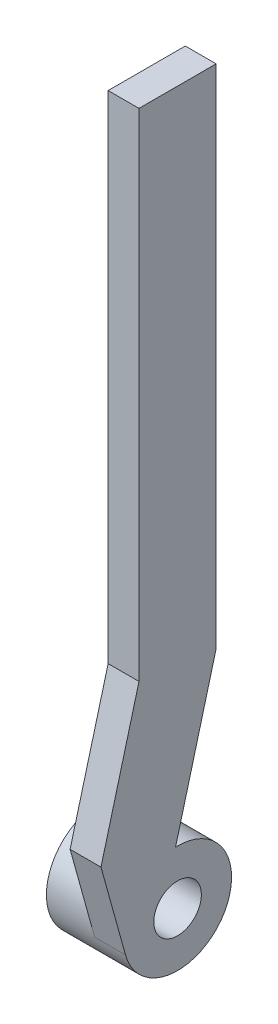
ISO-10303-21;
HEADER;
FILE_DESCRIPTION(('STEP AP214'),'2;1');
FILE_NAME('part.step','',(''),(''),'','','');
FILE_SCHEMA(('AUTOMOTIVE_DESIGN { 1 0 10303 214 1 1 1 1 }'));
ENDSEC;
DATA;
#1=APPLICATION_CONTEXT('core data for automotive mechanical design processes');
#2=APPLICATION_PROTOCOL_DEFINITION('international standard','automotive_design',2000,#1);
#3=PRODUCT_CONTEXT('',#1,'mechanical');
#4=PRODUCT('Part','Part','',(#3));
#5=PRODUCT_RELATED_PRODUCT_CATEGORY('part','',(#4));
#6=PRODUCT_DEFINITION_FORMATION('','',#4);
#7=PRODUCT_DEFINITION_CONTEXT('part definition',#1,'design');
#8=PRODUCT_DEFINITION('design','',#6,#7);
#9=PRODUCT_DEFINITION_SHAPE('','',#8);
#10=(LENGTH_UNIT() NAMED_UNIT(*) SI_UNIT(.MILLI.,.METRE.));
#11=(NAMED_UNIT(*) PLANE_ANGLE_UNIT() SI_UNIT($,.RADIAN.));
#12=(NAMED_UNIT(*) SI_UNIT($,.STERADIAN.) SOLID_ANGLE_UNIT());
#13=UNCERTAINTY_MEASURE_WITH_UNIT(LENGTH_MEASURE(1.E-05),#10,'distance_accuracy_value','');
#14=(GEOMETRIC_REPRESENTATION_CONTEXT(3) GLOBAL_UNCERTAINTY_ASSIGNED_CONTEXT((#13)) GLOBAL_UNIT_ASSIGNED_CONTEXT((#10,
#11,#12)) REPRESENTATION_CONTEXT('',''));
#15=CARTESIAN_POINT('',(0.,0.,0.));
#16=DIRECTION('',(0.,0.,1.));
#17=DIRECTION('',(1.,0.,0.));
#18=AXIS2_PLACEMENT_3D('',#15,#16,#17);
#19=CARTESIAN_POINT('',(-30.145,0.,0.));
#20=DIRECTION('',(1.,0.,0.));
#21=DIRECTION('',(0.,0.,1.));
#22=AXIS2_PLACEMENT_3D('',#19,#20,#21);
#23=CYLINDRICAL_SURFACE('',#22,7.);
#24=CARTESIAN_POINT('',(-30.145,0.,0.));
#25=DIRECTION('',(1.,0.,0.));
#26=DIRECTION('',(0.,0.,-1.));
#27=AXIS2_PLACEMENT_3D('',#24,#25,#26);
#28=CIRCLE('',#27,7.);
#29=CARTESIAN_POINT('',(-30.145,0.,-7.));
#30=VERTEX_POINT('',#29);
#31=EDGE_CURVE('E11',#30,#30,#28,.T.);
#32=ORIENTED_EDGE('',*,*,#31,.T.);
#33=EDGE_LOOP('',(#32));
#34=FACE_BOUND('',#33,.T.);
#35=DIRECTION('',(1.,0.,0.));
#36=VECTOR('',#35,1.);
#37=CARTESIAN_POINT('',(-24.145,6.99491771434268,0.266694899791794));
#38=LINE('',#37,#36);
#39=CARTESIAN_POINT('',(-24.145,6.99491771434268,0.266694899791794));
#40=VERTEX_POINT('',#39);
#41=CARTESIAN_POINT('',(-20.145,6.99491771434268,0.266694899791793));
#42=VERTEX_POINT('',#41);
#43=EDGE_CURVE('E111',#40,#42,#38,.T.);
#44=ORIENTED_EDGE('',*,*,#43,.T.);
#45=CARTESIAN_POINT('',(-20.145,0.,0.));
#46=DIRECTION('',(1.,0.,0.));
#47=DIRECTION('',(0.,0.,-1.));
#48=AXIS2_PLACEMENT_3D('',#45,#46,#47);
#49=CIRCLE('',#48,7.);
#50=CARTESIAN_POINT('',(-20.145,-1.87292477240286,6.74478708314204));
#51=VERTEX_POINT('',#50);
#52=EDGE_CURVE('E41',#51,#42,#49,.T.);
#53=ORIENTED_EDGE('',*,*,#52,.F.);
#54=DIRECTION('',(1.,0.,0.));
#55=VECTOR('',#54,1.);
#56=CARTESIAN_POINT('',(-24.145,-1.87292477240286,6.74478708314204));
#57=LINE('',#56,#55);
#58=CARTESIAN_POINT('',(-24.145,-1.87292477240286,6.74478708314204));
#59=VERTEX_POINT('',#58);
#60=EDGE_CURVE('E130',#59,#51,#57,.T.);
#61=ORIENTED_EDGE('',*,*,#60,.F.);
#62=CARTESIAN_POINT('',(-24.145,0.,0.));
#63=DIRECTION('',(1.,0.,0.));
#64=DIRECTION('',(0.,0.,-1.));
#65=AXIS2_PLACEMENT_3D('',#62,#63,#64);
#66=CIRCLE('',#65,7.);
#67=EDGE_CURVE('E117',#40,#59,#66,.T.);
#68=ORIENTED_EDGE('',*,*,#67,.F.);
#69=EDGE_LOOP('',(#44,#53,#61,#68));
#70=FACE_BOUND('',#69,.T.);
#71=ADVANCED_FACE('F37',(#34,#70),#23,.T.);
#72=CARTESIAN_POINT('',(-30.145,0.,0.));
#73=DIRECTION('',(1.,0.,0.));
#74=DIRECTION('',(0.,0.,1.));
#75=AXIS2_PLACEMENT_3D('',#72,#73,#74);
#76=CYLINDRICAL_SURFACE('',#75,3.0845);
#77=CARTESIAN_POINT('',(-20.145,0.,0.));
#78=DIRECTION('',(1.,0.,0.));
#79=DIRECTION('',(0.,0.,-1.));
#80=AXIS2_PLACEMENT_3D('',#77,#78,#79);
#81=CIRCLE('',#80,3.0845);
#82=CARTESIAN_POINT('',(-20.145,0.,-3.0845));
#83=VERTEX_POINT('',#82);
#84=EDGE_CURVE('E155',#83,#83,#81,.T.);
#85=ORIENTED_EDGE('',*,*,#84,.T.);
#86=EDGE_LOOP('',(#85));
#87=FACE_BOUND('',#86,.T.);
#88=CARTESIAN_POINT('',(-27.145,0.,0.));
#89=DIRECTION('',(1.,0.,0.));
#90=DIRECTION('',(0.,0.,-1.));
#91=AXIS2_PLACEMENT_3D('',#88,#89,#90);
#92=CIRCLE('',#91,3.0845);
#93=CARTESIAN_POINT('',(-27.145,0.,-3.0845));
#94=VERTEX_POINT('',#93);
#95=EDGE_CURVE('E153',#94,#94,#92,.T.);
#96=ORIENTED_EDGE('',*,*,#95,.F.);
#97=EDGE_LOOP('',(#96));
#98=FACE_BOUND('',#97,.T.);
#99=ADVANCED_FACE('F39',(#87,#98),#76,.F.);
#100=CARTESIAN_POINT('',(-30.145,0.,0.));
#101=DIRECTION('',(-1.,0.,0.));
#102=DIRECTION('',(0.,0.,-1.));
#103=AXIS2_PLACEMENT_3D('',#100,#101,#102);
#104=PLANE('',#103);
#105=ORIENTED_EDGE('',*,*,#31,.F.);
#106=EDGE_LOOP('',(#105));
#107=FACE_BOUND('',#106,.T.);
#108=ADVANCED_FACE('F191',(#107),#104,.T.);
#109=CARTESIAN_POINT('',(-20.145,0.,0.));
#110=DIRECTION('',(-1.,0.,0.));
#111=DIRECTION('',(0.,0.,-1.));
#112=AXIS2_PLACEMENT_3D('',#109,#110,#111);
#113=PLANE('',#112);
#114=ORIENTED_EDGE('',*,*,#84,.F.);
#115=EDGE_LOOP('',(#114));
#116=FACE_BOUND('',#115,.T.);
#117=ORIENTED_EDGE('',*,*,#52,.T.);
#118=DIRECTION('',(0.,0.965925826289068,-0.258819045102522));
#119=VECTOR('',#118,1.);
#120=CARTESIAN_POINT('',(-20.145,0.535244363118021,1.99755915762129));
#121=LINE('',#120,#119);
#122=CARTESIAN_POINT('',(-20.145,26.6504906683294,-4.99999999999999));
#123=VERTEX_POINT('',#122);
#124=EDGE_CURVE('E131',#42,#123,#121,.T.);
#125=ORIENTED_EDGE('',*,*,#124,.T.);
#126=DIRECTION('',(0.,1.,0.));
#127=VECTOR('',#126,1.);
#128=CARTESIAN_POINT('',(-20.145,0.,-4.99999999999999));
#129=LINE('',#128,#127);
#130=CARTESIAN_POINT('',(-20.145,92.2878720852358,-5.));
#131=VERTEX_POINT('',#130);
#132=EDGE_CURVE('E108',#123,#131,#129,.T.);
#133=ORIENTED_EDGE('',*,*,#132,.T.);
#134=DIRECTION('',(0.,0.,1.));
#135=VECTOR('',#134,1.);
#136=CARTESIAN_POINT('',(-20.145,92.2878720852358,0.));
#137=LINE('',#136,#135);
#138=CARTESIAN_POINT('',(-20.145,92.2878720852358,5.));
#139=VERTEX_POINT('',#138);
#140=EDGE_CURVE('E134',#131,#139,#137,.T.);
#141=ORIENTED_EDGE('',*,*,#140,.T.);
#142=DIRECTION('',(0.,-1.,0.));
#143=VECTOR('',#142,1.);
#144=CARTESIAN_POINT('',(-20.145,0.,5.));
#145=LINE('',#144,#143);
#146=CARTESIAN_POINT('',(-20.145,27.9670156442034,5.));
#147=VERTEX_POINT('',#146);
#148=EDGE_CURVE('E137',#139,#147,#145,.T.);
#149=ORIENTED_EDGE('',*,*,#148,.T.);
#150=DIRECTION('',(0.,-0.965925826289068,0.258819045102522));
#151=VECTOR('',#150,1.);
#152=CARTESIAN_POINT('',(-20.145,3.12343481414324,11.656817420512));
#153=LINE('',#152,#151);
#154=CARTESIAN_POINT('',(-20.145,9.5831081653679,9.92595316268248));
#155=VERTEX_POINT('',#154);
#156=EDGE_CURVE('E140',#147,#155,#153,.T.);
#157=ORIENTED_EDGE('',*,*,#156,.T.);
#158=DIRECTION('',(0.,-0.963541011877434,-0.267560681771837));
#159=VECTOR('',#158,1.);
#160=CARTESIAN_POINT('',(-20.145,-1.87292477240286,6.74478708314204));
#161=LINE('',#160,#159);
#162=EDGE_CURVE('E119',#155,#51,#161,.T.);
#163=ORIENTED_EDGE('',*,*,#162,.T.);
#164=EDGE_LOOP('',(#117,#125,#133,#141,#149,#157,#163));
#165=FACE_BOUND('',#164,.T.);
#166=ADVANCED_FACE('F162',(#116,#165),#113,.F.);
#167=CARTESIAN_POINT('',(-27.145,0.,0.));
#168=DIRECTION('',(-1.,0.,0.));
#169=DIRECTION('',(0.,0.,-1.));
#170=AXIS2_PLACEMENT_3D('',#167,#168,#169);
#171=PLANE('',#170);
#172=ORIENTED_EDGE('',*,*,#95,.T.);
#173=EDGE_LOOP('',(#172));
#174=FACE_BOUND('',#173,.T.);
#175=ADVANCED_FACE('F195',(#174),#171,.F.);
#176=CARTESIAN_POINT('',(-24.145,0.535244363118021,1.99755915762129));
#177=DIRECTION('',(0.,0.258819045102522,0.965925826289068));
#178=DIRECTION('',(0.,0.965925826289068,-0.258819045102522));
#179=AXIS2_PLACEMENT_3D('',#176,#177,#178);
#180=PLANE('',#179);
#181=ORIENTED_EDGE('',*,*,#124,.F.);
#182=ORIENTED_EDGE('',*,*,#43,.F.);
#183=DIRECTION('',(0.,0.965925826289068,-0.258819045102522));
#184=VECTOR('',#183,1.);
#185=CARTESIAN_POINT('',(-24.145,0.535244363118021,1.99755915762129));
#186=LINE('',#185,#184);
#187=CARTESIAN_POINT('',(-24.145,26.6504906683294,-4.99999999999999));
#188=VERTEX_POINT('',#187);
#189=EDGE_CURVE('E60',#40,#188,#186,.T.);
#190=ORIENTED_EDGE('',*,*,#189,.T.);
#191=DIRECTION('',(1.,0.,0.));
#192=VECTOR('',#191,1.);
#193=CARTESIAN_POINT('',(-24.145,26.6504906683294,-4.99999999999999));
#194=LINE('',#193,#192);
#195=EDGE_CURVE('E105',#188,#123,#194,.T.);
#196=ORIENTED_EDGE('',*,*,#195,.T.);
#197=EDGE_LOOP('',(#181,#182,#190,#196));
#198=FACE_BOUND('',#197,.T.);
#199=ADVANCED_FACE('F115',(#198),#180,.F.);
#200=CARTESIAN_POINT('',(-24.145,0.,-4.99999999999999));
#201=DIRECTION('',(0.,0.,1.));
#202=DIRECTION('',(0.,1.,0.));
#203=AXIS2_PLACEMENT_3D('',#200,#201,#202);
#204=PLANE('',#203);
#205=ORIENTED_EDGE('',*,*,#132,.F.);
#206=ORIENTED_EDGE('',*,*,#195,.F.);
#207=DIRECTION('',(0.,1.,0.));
#208=VECTOR('',#207,1.);
#209=CARTESIAN_POINT('',(-24.145,0.,-4.99999999999999));
#210=LINE('',#209,#208);
#211=CARTESIAN_POINT('',(-24.145,92.2878720852358,-5.));
#212=VERTEX_POINT('',#211);
#213=EDGE_CURVE('E96',#188,#212,#210,.T.);
#214=ORIENTED_EDGE('',*,*,#213,.T.);
#215=DIRECTION('',(1.,0.,0.));
#216=VECTOR('',#215,1.);
#217=CARTESIAN_POINT('',(-24.145,92.2878720852358,-5.));
#218=LINE('',#217,#216);
#219=EDGE_CURVE('E112',#212,#131,#218,.T.);
#220=ORIENTED_EDGE('',*,*,#219,.T.);
#221=EDGE_LOOP('',(#205,#206,#214,#220));
#222=FACE_BOUND('',#221,.T.);
#223=ADVANCED_FACE('F106',(#222),#204,.F.);
#224=CARTESIAN_POINT('',(-24.145,92.2878720852358,0.));
#225=DIRECTION('',(0.,-1.,0.));
#226=DIRECTION('',(1.,0.,0.));
#227=AXIS2_PLACEMENT_3D('',#224,#225,#226);
#228=PLANE('',#227);
#229=ORIENTED_EDGE('',*,*,#140,.F.);
#230=ORIENTED_EDGE('',*,*,#219,.F.);
#231=DIRECTION('',(0.,0.,1.));
#232=VECTOR('',#231,1.);
#233=CARTESIAN_POINT('',(-24.145,92.2878720852358,0.));
#234=LINE('',#233,#232);
#235=CARTESIAN_POINT('',(-24.145,92.2878720852358,5.));
#236=VERTEX_POINT('',#235);
#237=EDGE_CURVE('E100',#212,#236,#234,.T.);
#238=ORIENTED_EDGE('',*,*,#237,.T.);
#239=DIRECTION('',(1.,0.,0.));
#240=VECTOR('',#239,1.);
#241=CARTESIAN_POINT('',(-24.145,92.2878720852358,5.));
#242=LINE('',#241,#240);
#243=EDGE_CURVE('E149',#236,#139,#242,.T.);
#244=ORIENTED_EDGE('',*,*,#243,.T.);
#245=EDGE_LOOP('',(#229,#230,#238,#244));
#246=FACE_BOUND('',#245,.T.);
#247=ADVANCED_FACE('F177',(#246),#228,.F.);
#248=CARTESIAN_POINT('',(-24.145,0.,5.));
#249=DIRECTION('',(0.,0.,-1.));
#250=DIRECTION('',(1.,0.,0.));
#251=AXIS2_PLACEMENT_3D('',#248,#249,#250);
#252=PLANE('',#251);
#253=ORIENTED_EDGE('',*,*,#148,.F.);
#254=ORIENTED_EDGE('',*,*,#243,.F.);
#255=DIRECTION('',(0.,-1.,0.));
#256=VECTOR('',#255,1.);
#257=CARTESIAN_POINT('',(-24.145,0.,5.));
#258=LINE('',#257,#256);
#259=CARTESIAN_POINT('',(-24.145,27.9670156442034,5.));
#260=VERTEX_POINT('',#259);
#261=EDGE_CURVE('E123',#236,#260,#258,.T.);
#262=ORIENTED_EDGE('',*,*,#261,.T.);
#263=DIRECTION('',(1.,0.,0.));
#264=VECTOR('',#263,1.);
#265=CARTESIAN_POINT('',(-24.145,27.9670156442034,5.));
#266=LINE('',#265,#264);
#267=EDGE_CURVE('E147',#260,#147,#266,.T.);
#268=ORIENTED_EDGE('',*,*,#267,.T.);
#269=EDGE_LOOP('',(#253,#254,#262,#268));
#270=FACE_BOUND('',#269,.T.);
#271=ADVANCED_FACE('F174',(#270),#252,.F.);
#272=CARTESIAN_POINT('',(-24.145,3.12343481414324,11.656817420512));
#273=DIRECTION('',(0.,-0.258819045102521,-0.965925826289068));
#274=DIRECTION('',(0.,-0.965925826289068,0.258819045102521));
#275=AXIS2_PLACEMENT_3D('',#272,#273,#274);
#276=PLANE('',#275);
#277=ORIENTED_EDGE('',*,*,#156,.F.);
#278=ORIENTED_EDGE('',*,*,#267,.F.);
#279=DIRECTION('',(0.,-0.965925826289068,0.258819045102522));
#280=VECTOR('',#279,1.);
#281=CARTESIAN_POINT('',(-24.145,3.12343481414324,11.656817420512));
#282=LINE('',#281,#280);
#283=CARTESIAN_POINT('',(-24.145,9.5831081653679,9.92595316268248));
#284=VERTEX_POINT('',#283);
#285=EDGE_CURVE('E126',#260,#284,#282,.T.);
#286=ORIENTED_EDGE('',*,*,#285,.T.);
#287=DIRECTION('',(1.,0.,0.));
#288=VECTOR('',#287,1.);
#289=CARTESIAN_POINT('',(-24.145,9.5831081653679,9.92595316268248));
#290=LINE('',#289,#288);
#291=EDGE_CURVE('E145',#284,#155,#290,.T.);
#292=ORIENTED_EDGE('',*,*,#291,.T.);
#293=EDGE_LOOP('',(#277,#278,#286,#292));
#294=FACE_BOUND('',#293,.T.);
#295=ADVANCED_FACE('F170',(#294),#276,.F.);
#296=CARTESIAN_POINT('',(-24.145,-1.87292477240286,6.74478708314204));
#297=DIRECTION('',(0.,0.267560681771837,-0.963541011877434));
#298=DIRECTION('',(0.,-0.963541011877434,-0.267560681771837));
#299=AXIS2_PLACEMENT_3D('',#296,#297,#298);
#300=PLANE('',#299);
#301=ORIENTED_EDGE('',*,*,#162,.F.);
#302=ORIENTED_EDGE('',*,*,#291,.F.);
#303=DIRECTION('',(0.,-0.963541011877434,-0.267560681771837));
#304=VECTOR('',#303,1.);
#305=CARTESIAN_POINT('',(-24.145,-1.87292477240286,6.74478708314204));
#306=LINE('',#305,#304);
#307=EDGE_CURVE('E53',#284,#59,#306,.T.);
#308=ORIENTED_EDGE('',*,*,#307,.T.);
#309=ORIENTED_EDGE('',*,*,#60,.T.);
#310=EDGE_LOOP('',(#301,#302,#308,#309));
#311=FACE_BOUND('',#310,.T.);
#312=ADVANCED_FACE('F167',(#311),#300,.F.);
#313=CARTESIAN_POINT('',(-24.145,0.,0.));
#314=DIRECTION('',(-1.,0.,0.));
#315=DIRECTION('',(0.,0.,-1.));
#316=AXIS2_PLACEMENT_3D('',#313,#314,#315);
#317=PLANE('',#316);
#318=ORIENTED_EDGE('',*,*,#67,.T.);
#319=ORIENTED_EDGE('',*,*,#307,.F.);
#320=ORIENTED_EDGE('',*,*,#285,.F.);
#321=ORIENTED_EDGE('',*,*,#261,.F.);
#322=ORIENTED_EDGE('',*,*,#237,.F.);
#323=ORIENTED_EDGE('',*,*,#213,.F.);
#324=ORIENTED_EDGE('',*,*,#189,.F.);
#325=EDGE_LOOP('',(#318,#319,#320,#321,#322,#323,#324));
#326=FACE_BOUND('',#325,.T.);
#327=ADVANCED_FACE('F98',(#326),#317,.T.);
#328=CLOSED_SHELL('',(#71,#99,#108,#166,#175,#199,#223,#247,#271,#295,#312,#327));
#329=MANIFOLD_SOLID_BREP('B2',#328);
#330=ADVANCED_BREP_SHAPE_REPRESENTATION('',(#18,#329),#14);
#331=SHAPE_DEFINITION_REPRESENTATION(#9,#330);
ENDSEC;
END-ISO-10303-21;
